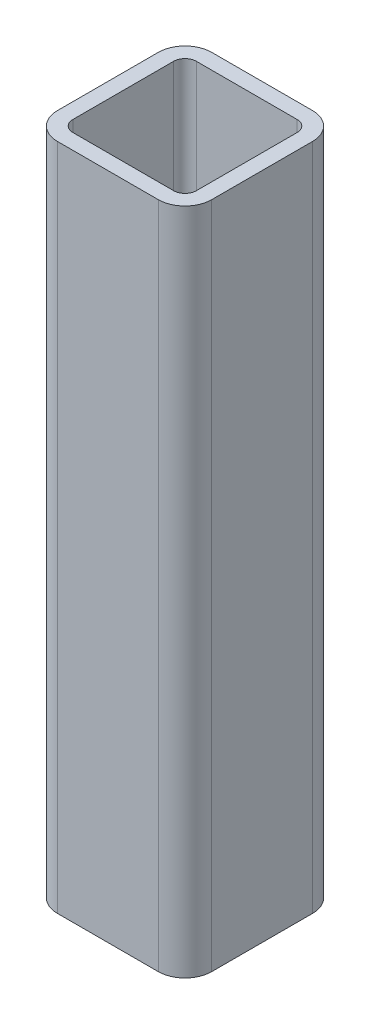
ISO-10303-21;
HEADER;
FILE_DESCRIPTION(('STEP AP214'),'2;1');
FILE_NAME('part.step','',(''),(''),'','','');
FILE_SCHEMA(('AUTOMOTIVE_DESIGN { 1 0 10303 214 1 1 1 1 }'));
ENDSEC;
DATA;
#1=APPLICATION_CONTEXT('core data for automotive mechanical design processes');
#2=APPLICATION_PROTOCOL_DEFINITION('international standard','automotive_design',2000,#1);
#3=PRODUCT_CONTEXT('',#1,'mechanical');
#4=PRODUCT('Part','Part','',(#3));
#5=PRODUCT_RELATED_PRODUCT_CATEGORY('part','',(#4));
#6=PRODUCT_DEFINITION_FORMATION('','',#4);
#7=PRODUCT_DEFINITION_CONTEXT('part definition',#1,'design');
#8=PRODUCT_DEFINITION('design','',#6,#7);
#9=PRODUCT_DEFINITION_SHAPE('','',#8);
#10=(LENGTH_UNIT() NAMED_UNIT(*) SI_UNIT(.MILLI.,.METRE.));
#11=(NAMED_UNIT(*) PLANE_ANGLE_UNIT() SI_UNIT($,.RADIAN.));
#12=(NAMED_UNIT(*) SI_UNIT($,.STERADIAN.) SOLID_ANGLE_UNIT());
#13=UNCERTAINTY_MEASURE_WITH_UNIT(LENGTH_MEASURE(1.E-05),#10,'distance_accuracy_value','');
#14=(GEOMETRIC_REPRESENTATION_CONTEXT(3) GLOBAL_UNCERTAINTY_ASSIGNED_CONTEXT((#13)) GLOBAL_UNIT_ASSIGNED_CONTEXT((#10,
#11,#12)) REPRESENTATION_CONTEXT('',''));
#15=CARTESIAN_POINT('',(0.,0.,0.));
#16=DIRECTION('',(0.,0.,1.));
#17=DIRECTION('',(1.,0.,0.));
#18=AXIS2_PLACEMENT_3D('',#15,#16,#17);
#19=CARTESIAN_POINT('',(9.8,130.,-9.8));
#20=DIRECTION('',(0.,-1.,0.));
#21=DIRECTION('',(0.,0.,-1.));
#22=AXIS2_PLACEMENT_3D('',#19,#20,#21);
#23=CYLINDRICAL_SURFACE('',#22,5.2);
#24=CARTESIAN_POINT('',(9.8,0.,-9.8));
#25=DIRECTION('',(0.,1.,0.));
#26=DIRECTION('',(0.,0.,1.));
#27=AXIS2_PLACEMENT_3D('',#24,#25,#26);
#28=CIRCLE('',#27,5.2);
#29=CARTESIAN_POINT('',(15.,0.,-9.8));
#30=VERTEX_POINT('',#29);
#31=CARTESIAN_POINT('',(9.8,0.,-15.));
#32=VERTEX_POINT('',#31);
#33=EDGE_CURVE('E239',#30,#32,#28,.T.);
#34=ORIENTED_EDGE('',*,*,#33,.T.);
#35=DIRECTION('',(0.,-1.,0.));
#36=VECTOR('',#35,1.);
#37=CARTESIAN_POINT('',(9.8,130.,-15.));
#38=LINE('',#37,#36);
#39=CARTESIAN_POINT('',(9.8,130.,-15.));
#40=VERTEX_POINT('',#39);
#41=EDGE_CURVE('E12',#40,#32,#38,.T.);
#42=ORIENTED_EDGE('',*,*,#41,.F.);
#43=CARTESIAN_POINT('',(9.8,130.,-9.8));
#44=DIRECTION('',(0.,1.,0.));
#45=DIRECTION('',(0.,0.,1.));
#46=AXIS2_PLACEMENT_3D('',#43,#44,#45);
#47=CIRCLE('',#46,5.2);
#48=CARTESIAN_POINT('',(15.,130.,-9.8));
#49=VERTEX_POINT('',#48);
#50=EDGE_CURVE('E317',#49,#40,#47,.T.);
#51=ORIENTED_EDGE('',*,*,#50,.F.);
#52=DIRECTION('',(0.,-1.,0.));
#53=VECTOR('',#52,1.);
#54=CARTESIAN_POINT('',(15.,130.,-9.8));
#55=LINE('',#54,#53);
#56=EDGE_CURVE('E254',#49,#30,#55,.T.);
#57=ORIENTED_EDGE('',*,*,#56,.T.);
#58=EDGE_LOOP('',(#34,#42,#51,#57));
#59=FACE_BOUND('',#58,.T.);
#60=ADVANCED_FACE('F67',(#59),#23,.T.);
#61=CARTESIAN_POINT('',(9.8,130.,-15.));
#62=DIRECTION('',(0.,0.,1.));
#63=DIRECTION('',(1.,0.,0.));
#64=AXIS2_PLACEMENT_3D('',#61,#62,#63);
#65=PLANE('',#64);
#66=DIRECTION('',(-1.,0.,0.));
#67=VECTOR('',#66,1.);
#68=CARTESIAN_POINT('',(9.8,0.,-15.));
#69=LINE('',#68,#67);
#70=CARTESIAN_POINT('',(-9.8,0.,-15.));
#71=VERTEX_POINT('',#70);
#72=EDGE_CURVE('E242',#32,#71,#69,.T.);
#73=ORIENTED_EDGE('',*,*,#72,.T.);
#74=DIRECTION('',(0.,-1.,0.));
#75=VECTOR('',#74,1.);
#76=CARTESIAN_POINT('',(-9.8,130.,-15.));
#77=LINE('',#76,#75);
#78=CARTESIAN_POINT('',(-9.8,130.,-15.));
#79=VERTEX_POINT('',#78);
#80=EDGE_CURVE('E77',#79,#71,#77,.T.);
#81=ORIENTED_EDGE('',*,*,#80,.F.);
#82=DIRECTION('',(-1.,0.,0.));
#83=VECTOR('',#82,1.);
#84=CARTESIAN_POINT('',(9.8,130.,-15.));
#85=LINE('',#84,#83);
#86=EDGE_CURVE('E319',#40,#79,#85,.T.);
#87=ORIENTED_EDGE('',*,*,#86,.F.);
#88=ORIENTED_EDGE('',*,*,#41,.T.);
#89=EDGE_LOOP('',(#73,#81,#87,#88));
#90=FACE_BOUND('',#89,.T.);
#91=ADVANCED_FACE('F354',(#90),#65,.F.);
#92=CARTESIAN_POINT('',(-9.8,130.,-9.8));
#93=DIRECTION('',(0.,-1.,0.));
#94=DIRECTION('',(0.,0.,-1.));
#95=AXIS2_PLACEMENT_3D('',#92,#93,#94);
#96=CYLINDRICAL_SURFACE('',#95,5.2);
#97=CARTESIAN_POINT('',(-9.8,0.,-9.8));
#98=DIRECTION('',(0.,1.,0.));
#99=DIRECTION('',(0.,0.,1.));
#100=AXIS2_PLACEMENT_3D('',#97,#98,#99);
#101=CIRCLE('',#100,5.2);
#102=CARTESIAN_POINT('',(-15.,0.,-9.8));
#103=VERTEX_POINT('',#102);
#104=EDGE_CURVE('E244',#71,#103,#101,.T.);
#105=ORIENTED_EDGE('',*,*,#104,.T.);
#106=DIRECTION('',(0.,-1.,0.));
#107=VECTOR('',#106,1.);
#108=CARTESIAN_POINT('',(-15.,130.,-9.8));
#109=LINE('',#108,#107);
#110=CARTESIAN_POINT('',(-15.,130.,-9.8));
#111=VERTEX_POINT('',#110);
#112=EDGE_CURVE('E261',#111,#103,#109,.T.);
#113=ORIENTED_EDGE('',*,*,#112,.F.);
#114=CARTESIAN_POINT('',(-9.8,130.,-9.8));
#115=DIRECTION('',(0.,1.,0.));
#116=DIRECTION('',(0.,0.,1.));
#117=AXIS2_PLACEMENT_3D('',#114,#115,#116);
#118=CIRCLE('',#117,5.2);
#119=EDGE_CURVE('E321',#79,#111,#118,.T.);
#120=ORIENTED_EDGE('',*,*,#119,.F.);
#121=ORIENTED_EDGE('',*,*,#80,.T.);
#122=EDGE_LOOP('',(#105,#113,#120,#121));
#123=FACE_BOUND('',#122,.T.);
#124=ADVANCED_FACE('F359',(#123),#96,.T.);
#125=CARTESIAN_POINT('',(-15.,130.,9.8));
#126=DIRECTION('',(1.,0.,0.));
#127=DIRECTION('',(0.,0.,-1.));
#128=AXIS2_PLACEMENT_3D('',#125,#126,#127);
#129=PLANE('',#128);
#130=DIRECTION('',(0.,0.,1.));
#131=VECTOR('',#130,1.);
#132=CARTESIAN_POINT('',(-15.,0.,9.8));
#133=LINE('',#132,#131);
#134=CARTESIAN_POINT('',(-15.,0.,9.8));
#135=VERTEX_POINT('',#134);
#136=EDGE_CURVE('E246',#103,#135,#133,.T.);
#137=ORIENTED_EDGE('',*,*,#136,.T.);
#138=DIRECTION('',(0.,-1.,0.));
#139=VECTOR('',#138,1.);
#140=CARTESIAN_POINT('',(-15.,130.,9.8));
#141=LINE('',#140,#139);
#142=CARTESIAN_POINT('',(-15.,130.,9.8));
#143=VERTEX_POINT('',#142);
#144=EDGE_CURVE('E258',#143,#135,#141,.T.);
#145=ORIENTED_EDGE('',*,*,#144,.F.);
#146=DIRECTION('',(0.,0.,1.));
#147=VECTOR('',#146,1.);
#148=CARTESIAN_POINT('',(-15.,130.,9.8));
#149=LINE('',#148,#147);
#150=EDGE_CURVE('E323',#111,#143,#149,.T.);
#151=ORIENTED_EDGE('',*,*,#150,.F.);
#152=ORIENTED_EDGE('',*,*,#112,.T.);
#153=EDGE_LOOP('',(#137,#145,#151,#152));
#154=FACE_BOUND('',#153,.T.);
#155=ADVANCED_FACE('F329',(#154),#129,.F.);
#156=CARTESIAN_POINT('',(-9.8,130.,9.8));
#157=DIRECTION('',(0.,-1.,0.));
#158=DIRECTION('',(0.,0.,-1.));
#159=AXIS2_PLACEMENT_3D('',#156,#157,#158);
#160=CYLINDRICAL_SURFACE('',#159,5.2);
#161=CARTESIAN_POINT('',(-9.8,0.,9.8));
#162=DIRECTION('',(0.,1.,0.));
#163=DIRECTION('',(0.,0.,1.));
#164=AXIS2_PLACEMENT_3D('',#161,#162,#163);
#165=CIRCLE('',#164,5.2);
#166=CARTESIAN_POINT('',(-9.8,0.,15.));
#167=VERTEX_POINT('',#166);
#168=EDGE_CURVE('E248',#135,#167,#165,.T.);
#169=ORIENTED_EDGE('',*,*,#168,.T.);
#170=DIRECTION('',(0.,-1.,0.));
#171=VECTOR('',#170,1.);
#172=CARTESIAN_POINT('',(-9.8,130.,15.));
#173=LINE('',#172,#171);
#174=CARTESIAN_POINT('',(-9.8,130.,15.));
#175=VERTEX_POINT('',#174);
#176=EDGE_CURVE('E206',#175,#167,#173,.T.);
#177=ORIENTED_EDGE('',*,*,#176,.F.);
#178=CARTESIAN_POINT('',(-9.8,130.,9.8));
#179=DIRECTION('',(0.,1.,0.));
#180=DIRECTION('',(0.,0.,1.));
#181=AXIS2_PLACEMENT_3D('',#178,#179,#180);
#182=CIRCLE('',#181,5.2);
#183=EDGE_CURVE('E197',#143,#175,#182,.T.);
#184=ORIENTED_EDGE('',*,*,#183,.F.);
#185=ORIENTED_EDGE('',*,*,#144,.T.);
#186=EDGE_LOOP('',(#169,#177,#184,#185));
#187=FACE_BOUND('',#186,.T.);
#188=ADVANCED_FACE('F333',(#187),#160,.T.);
#189=CARTESIAN_POINT('',(-9.8,130.,15.));
#190=DIRECTION('',(0.,0.,-1.));
#191=DIRECTION('',(-1.,0.,0.));
#192=AXIS2_PLACEMENT_3D('',#189,#190,#191);
#193=PLANE('',#192);
#194=DIRECTION('',(1.,0.,0.));
#195=VECTOR('',#194,1.);
#196=CARTESIAN_POINT('',(-9.8,0.,15.));
#197=LINE('',#196,#195);
#198=CARTESIAN_POINT('',(9.8,0.,15.));
#199=VERTEX_POINT('',#198);
#200=EDGE_CURVE('E205',#167,#199,#197,.T.);
#201=ORIENTED_EDGE('',*,*,#200,.T.);
#202=DIRECTION('',(0.,-1.,0.));
#203=VECTOR('',#202,1.);
#204=CARTESIAN_POINT('',(9.8,130.,15.));
#205=LINE('',#204,#203);
#206=CARTESIAN_POINT('',(9.8,130.,15.));
#207=VERTEX_POINT('',#206);
#208=EDGE_CURVE('E202',#207,#199,#205,.T.);
#209=ORIENTED_EDGE('',*,*,#208,.F.);
#210=DIRECTION('',(1.,0.,0.));
#211=VECTOR('',#210,1.);
#212=CARTESIAN_POINT('',(-9.8,130.,15.));
#213=LINE('',#212,#211);
#214=EDGE_CURVE('E191',#175,#207,#213,.T.);
#215=ORIENTED_EDGE('',*,*,#214,.F.);
#216=ORIENTED_EDGE('',*,*,#176,.T.);
#217=EDGE_LOOP('',(#201,#209,#215,#216));
#218=FACE_BOUND('',#217,.T.);
#219=ADVANCED_FACE('F203',(#218),#193,.F.);
#220=CARTESIAN_POINT('',(9.8,130.,9.8));
#221=DIRECTION('',(0.,-1.,0.));
#222=DIRECTION('',(0.,0.,-1.));
#223=AXIS2_PLACEMENT_3D('',#220,#221,#222);
#224=CYLINDRICAL_SURFACE('',#223,5.2);
#225=CARTESIAN_POINT('',(9.8,0.,9.8));
#226=DIRECTION('',(0.,1.,0.));
#227=DIRECTION('',(0.,0.,1.));
#228=AXIS2_PLACEMENT_3D('',#225,#226,#227);
#229=CIRCLE('',#228,5.2);
#230=CARTESIAN_POINT('',(15.,0.,9.8));
#231=VERTEX_POINT('',#230);
#232=EDGE_CURVE('E139',#199,#231,#229,.T.);
#233=ORIENTED_EDGE('',*,*,#232,.T.);
#234=DIRECTION('',(0.,-1.,0.));
#235=VECTOR('',#234,1.);
#236=CARTESIAN_POINT('',(15.,130.,9.8));
#237=LINE('',#236,#235);
#238=CARTESIAN_POINT('',(15.,130.,9.8));
#239=VERTEX_POINT('',#238);
#240=EDGE_CURVE('E207',#239,#231,#237,.T.);
#241=ORIENTED_EDGE('',*,*,#240,.F.);
#242=CARTESIAN_POINT('',(9.8,130.,9.8));
#243=DIRECTION('',(0.,1.,0.));
#244=DIRECTION('',(0.,0.,1.));
#245=AXIS2_PLACEMENT_3D('',#242,#243,#244);
#246=CIRCLE('',#245,5.2);
#247=EDGE_CURVE('E195',#207,#239,#246,.T.);
#248=ORIENTED_EDGE('',*,*,#247,.F.);
#249=ORIENTED_EDGE('',*,*,#208,.T.);
#250=EDGE_LOOP('',(#233,#241,#248,#249));
#251=FACE_BOUND('',#250,.T.);
#252=ADVANCED_FACE('F209',(#251),#224,.T.);
#253=CARTESIAN_POINT('',(-9.8,130.,-9.8));
#254=DIRECTION('',(0.,-1.,0.));
#255=DIRECTION('',(0.,0.,-1.));
#256=AXIS2_PLACEMENT_3D('',#253,#254,#255);
#257=CYLINDRICAL_SURFACE('',#256,2.2);
#258=CARTESIAN_POINT('',(-9.8,0.,-9.8));
#259=DIRECTION('',(0.,1.,0.));
#260=DIRECTION('',(0.,0.,1.));
#261=AXIS2_PLACEMENT_3D('',#258,#259,#260);
#262=CIRCLE('',#261,2.2);
#263=CARTESIAN_POINT('',(-9.8,0.,-12.));
#264=VERTEX_POINT('',#263);
#265=CARTESIAN_POINT('',(-12.,0.,-9.8));
#266=VERTEX_POINT('',#265);
#267=EDGE_CURVE('E215',#264,#266,#262,.T.);
#268=ORIENTED_EDGE('',*,*,#267,.F.);
#269=DIRECTION('',(0.,-1.,0.));
#270=VECTOR('',#269,1.);
#271=CARTESIAN_POINT('',(-9.8,130.,-12.));
#272=LINE('',#271,#270);
#273=CARTESIAN_POINT('',(-9.8,130.,-12.));
#274=VERTEX_POINT('',#273);
#275=EDGE_CURVE('E71',#274,#264,#272,.T.);
#276=ORIENTED_EDGE('',*,*,#275,.F.);
#277=CARTESIAN_POINT('',(-9.8,130.,-9.8));
#278=DIRECTION('',(0.,1.,0.));
#279=DIRECTION('',(0.,0.,1.));
#280=AXIS2_PLACEMENT_3D('',#277,#278,#279);
#281=CIRCLE('',#280,2.2);
#282=CARTESIAN_POINT('',(-12.,130.,-9.8));
#283=VERTEX_POINT('',#282);
#284=EDGE_CURVE('E253',#274,#283,#281,.T.);
#285=ORIENTED_EDGE('',*,*,#284,.T.);
#286=DIRECTION('',(0.,-1.,0.));
#287=VECTOR('',#286,1.);
#288=CARTESIAN_POINT('',(-12.,130.,-9.8));
#289=LINE('',#288,#287);
#290=EDGE_CURVE('E211',#283,#266,#289,.T.);
#291=ORIENTED_EDGE('',*,*,#290,.T.);
#292=EDGE_LOOP('',(#268,#276,#285,#291));
#293=FACE_BOUND('',#292,.T.);
#294=ADVANCED_FACE('F69',(#293),#257,.F.);
#295=CARTESIAN_POINT('',(9.8,130.,-12.));
#296=DIRECTION('',(0.,0.,1.));
#297=DIRECTION('',(1.,0.,0.));
#298=AXIS2_PLACEMENT_3D('',#295,#296,#297);
#299=PLANE('',#298);
#300=DIRECTION('',(-1.,0.,0.));
#301=VECTOR('',#300,1.);
#302=CARTESIAN_POINT('',(9.8,0.,-12.));
#303=LINE('',#302,#301);
#304=CARTESIAN_POINT('',(9.8,0.,-12.));
#305=VERTEX_POINT('',#304);
#306=EDGE_CURVE('E218',#305,#264,#303,.T.);
#307=ORIENTED_EDGE('',*,*,#306,.F.);
#308=DIRECTION('',(0.,-1.,0.));
#309=VECTOR('',#308,1.);
#310=CARTESIAN_POINT('',(9.8,130.,-12.));
#311=LINE('',#310,#309);
#312=CARTESIAN_POINT('',(9.8,130.,-12.));
#313=VERTEX_POINT('',#312);
#314=EDGE_CURVE('E276',#313,#305,#311,.T.);
#315=ORIENTED_EDGE('',*,*,#314,.F.);
#316=DIRECTION('',(-1.,0.,0.));
#317=VECTOR('',#316,1.);
#318=CARTESIAN_POINT('',(9.8,130.,-12.));
#319=LINE('',#318,#317);
#320=EDGE_CURVE('E285',#313,#274,#319,.T.);
#321=ORIENTED_EDGE('',*,*,#320,.T.);
#322=ORIENTED_EDGE('',*,*,#275,.T.);
#323=EDGE_LOOP('',(#307,#315,#321,#322));
#324=FACE_BOUND('',#323,.T.);
#325=ADVANCED_FACE('F283',(#324),#299,.T.);
#326=CARTESIAN_POINT('',(9.8,130.,-9.8));
#327=DIRECTION('',(0.,-1.,0.));
#328=DIRECTION('',(0.,0.,-1.));
#329=AXIS2_PLACEMENT_3D('',#326,#327,#328);
#330=CYLINDRICAL_SURFACE('',#329,2.2);
#331=CARTESIAN_POINT('',(9.8,0.,-9.8));
#332=DIRECTION('',(0.,1.,0.));
#333=DIRECTION('',(0.,0.,1.));
#334=AXIS2_PLACEMENT_3D('',#331,#332,#333);
#335=CIRCLE('',#334,2.2);
#336=CARTESIAN_POINT('',(12.,0.,-9.8));
#337=VERTEX_POINT('',#336);
#338=EDGE_CURVE('E221',#337,#305,#335,.T.);
#339=ORIENTED_EDGE('',*,*,#338,.F.);
#340=DIRECTION('',(0.,-1.,0.));
#341=VECTOR('',#340,1.);
#342=CARTESIAN_POINT('',(12.,130.,-9.8));
#343=LINE('',#342,#341);
#344=CARTESIAN_POINT('',(12.,130.,-9.8));
#345=VERTEX_POINT('',#344);
#346=EDGE_CURVE('E275',#345,#337,#343,.T.);
#347=ORIENTED_EDGE('',*,*,#346,.F.);
#348=CARTESIAN_POINT('',(9.8,130.,-9.8));
#349=DIRECTION('',(0.,1.,0.));
#350=DIRECTION('',(0.,0.,1.));
#351=AXIS2_PLACEMENT_3D('',#348,#349,#350);
#352=CIRCLE('',#351,2.2);
#353=EDGE_CURVE('E293',#345,#313,#352,.T.);
#354=ORIENTED_EDGE('',*,*,#353,.T.);
#355=ORIENTED_EDGE('',*,*,#314,.T.);
#356=EDGE_LOOP('',(#339,#347,#354,#355));
#357=FACE_BOUND('',#356,.T.);
#358=ADVANCED_FACE('F291',(#357),#330,.F.);
#359=CARTESIAN_POINT('',(12.,130.,-9.8));
#360=DIRECTION('',(-1.,0.,0.));
#361=DIRECTION('',(0.,0.,1.));
#362=AXIS2_PLACEMENT_3D('',#359,#360,#361);
#363=PLANE('',#362);
#364=DIRECTION('',(0.,0.,-1.));
#365=VECTOR('',#364,1.);
#366=CARTESIAN_POINT('',(12.,0.,-9.8));
#367=LINE('',#366,#365);
#368=CARTESIAN_POINT('',(12.,0.,9.8));
#369=VERTEX_POINT('',#368);
#370=EDGE_CURVE('E224',#369,#337,#367,.T.);
#371=ORIENTED_EDGE('',*,*,#370,.F.);
#372=DIRECTION('',(0.,-1.,0.));
#373=VECTOR('',#372,1.);
#374=CARTESIAN_POINT('',(12.,130.,9.8));
#375=LINE('',#374,#373);
#376=CARTESIAN_POINT('',(12.,130.,9.8));
#377=VERTEX_POINT('',#376);
#378=EDGE_CURVE('E273',#377,#369,#375,.T.);
#379=ORIENTED_EDGE('',*,*,#378,.F.);
#380=DIRECTION('',(0.,0.,-1.));
#381=VECTOR('',#380,1.);
#382=CARTESIAN_POINT('',(12.,130.,-9.8));
#383=LINE('',#382,#381);
#384=EDGE_CURVE('E299',#377,#345,#383,.T.);
#385=ORIENTED_EDGE('',*,*,#384,.T.);
#386=ORIENTED_EDGE('',*,*,#346,.T.);
#387=EDGE_LOOP('',(#371,#379,#385,#386));
#388=FACE_BOUND('',#387,.T.);
#389=ADVANCED_FACE('F302',(#388),#363,.T.);
#390=CARTESIAN_POINT('',(9.8,130.,9.8));
#391=DIRECTION('',(0.,-1.,0.));
#392=DIRECTION('',(0.,0.,-1.));
#393=AXIS2_PLACEMENT_3D('',#390,#391,#392);
#394=CYLINDRICAL_SURFACE('',#393,2.2);
#395=CARTESIAN_POINT('',(9.8,0.,9.8));
#396=DIRECTION('',(0.,1.,0.));
#397=DIRECTION('',(0.,0.,1.));
#398=AXIS2_PLACEMENT_3D('',#395,#396,#397);
#399=CIRCLE('',#398,2.2);
#400=CARTESIAN_POINT('',(9.8,0.,12.));
#401=VERTEX_POINT('',#400);
#402=EDGE_CURVE('E227',#401,#369,#399,.T.);
#403=ORIENTED_EDGE('',*,*,#402,.F.);
#404=DIRECTION('',(0.,-1.,0.));
#405=VECTOR('',#404,1.);
#406=CARTESIAN_POINT('',(9.8,130.,12.));
#407=LINE('',#406,#405);
#408=CARTESIAN_POINT('',(9.8,130.,12.));
#409=VERTEX_POINT('',#408);
#410=EDGE_CURVE('E271',#409,#401,#407,.T.);
#411=ORIENTED_EDGE('',*,*,#410,.F.);
#412=CARTESIAN_POINT('',(9.8,130.,9.8));
#413=DIRECTION('',(0.,1.,0.));
#414=DIRECTION('',(0.,0.,1.));
#415=AXIS2_PLACEMENT_3D('',#412,#413,#414);
#416=CIRCLE('',#415,2.2);
#417=EDGE_CURVE('E303',#409,#377,#416,.T.);
#418=ORIENTED_EDGE('',*,*,#417,.T.);
#419=ORIENTED_EDGE('',*,*,#378,.T.);
#420=EDGE_LOOP('',(#403,#411,#418,#419));
#421=FACE_BOUND('',#420,.T.);
#422=ADVANCED_FACE('F370',(#421),#394,.F.);
#423=CARTESIAN_POINT('',(-9.8,130.,12.));
#424=DIRECTION('',(0.,0.,-1.));
#425=DIRECTION('',(-1.,0.,0.));
#426=AXIS2_PLACEMENT_3D('',#423,#424,#425);
#427=PLANE('',#426);
#428=DIRECTION('',(1.,0.,0.));
#429=VECTOR('',#428,1.);
#430=CARTESIAN_POINT('',(-9.8,0.,12.));
#431=LINE('',#430,#429);
#432=CARTESIAN_POINT('',(-9.8,0.,12.));
#433=VERTEX_POINT('',#432);
#434=EDGE_CURVE('E230',#433,#401,#431,.T.);
#435=ORIENTED_EDGE('',*,*,#434,.F.);
#436=DIRECTION('',(0.,-1.,0.));
#437=VECTOR('',#436,1.);
#438=CARTESIAN_POINT('',(-9.8,130.,12.));
#439=LINE('',#438,#437);
#440=CARTESIAN_POINT('',(-9.8,130.,12.));
#441=VERTEX_POINT('',#440);
#442=EDGE_CURVE('E269',#441,#433,#439,.T.);
#443=ORIENTED_EDGE('',*,*,#442,.F.);
#444=DIRECTION('',(1.,0.,0.));
#445=VECTOR('',#444,1.);
#446=CARTESIAN_POINT('',(-9.8,130.,12.));
#447=LINE('',#446,#445);
#448=EDGE_CURVE('E305',#441,#409,#447,.T.);
#449=ORIENTED_EDGE('',*,*,#448,.T.);
#450=ORIENTED_EDGE('',*,*,#410,.T.);
#451=EDGE_LOOP('',(#435,#443,#449,#450));
#452=FACE_BOUND('',#451,.T.);
#453=ADVANCED_FACE('F366',(#452),#427,.T.);
#454=CARTESIAN_POINT('',(-9.8,130.,9.8));
#455=DIRECTION('',(0.,-1.,0.));
#456=DIRECTION('',(0.,0.,-1.));
#457=AXIS2_PLACEMENT_3D('',#454,#455,#456);
#458=CYLINDRICAL_SURFACE('',#457,2.2);
#459=CARTESIAN_POINT('',(-9.8,0.,9.8));
#460=DIRECTION('',(0.,1.,0.));
#461=DIRECTION('',(0.,0.,1.));
#462=AXIS2_PLACEMENT_3D('',#459,#460,#461);
#463=CIRCLE('',#462,2.2);
#464=CARTESIAN_POINT('',(-12.,0.,9.8));
#465=VERTEX_POINT('',#464);
#466=EDGE_CURVE('E233',#465,#433,#463,.T.);
#467=ORIENTED_EDGE('',*,*,#466,.F.);
#468=DIRECTION('',(0.,-1.,0.));
#469=VECTOR('',#468,1.);
#470=CARTESIAN_POINT('',(-12.,130.,9.8));
#471=LINE('',#470,#469);
#472=CARTESIAN_POINT('',(-12.,130.,9.8));
#473=VERTEX_POINT('',#472);
#474=EDGE_CURVE('E267',#473,#465,#471,.T.);
#475=ORIENTED_EDGE('',*,*,#474,.F.);
#476=CARTESIAN_POINT('',(-9.8,130.,9.8));
#477=DIRECTION('',(0.,1.,0.));
#478=DIRECTION('',(0.,0.,1.));
#479=AXIS2_PLACEMENT_3D('',#476,#477,#478);
#480=CIRCLE('',#479,2.2);
#481=EDGE_CURVE('E311',#473,#441,#480,.T.);
#482=ORIENTED_EDGE('',*,*,#481,.T.);
#483=ORIENTED_EDGE('',*,*,#442,.T.);
#484=EDGE_LOOP('',(#467,#475,#482,#483));
#485=FACE_BOUND('',#484,.T.);
#486=ADVANCED_FACE('F348',(#485),#458,.F.);
#487=CARTESIAN_POINT('',(-12.,130.,9.8));
#488=DIRECTION('',(1.,0.,0.));
#489=DIRECTION('',(0.,0.,-1.));
#490=AXIS2_PLACEMENT_3D('',#487,#488,#489);
#491=PLANE('',#490);
#492=DIRECTION('',(0.,0.,1.));
#493=VECTOR('',#492,1.);
#494=CARTESIAN_POINT('',(-12.,0.,9.8));
#495=LINE('',#494,#493);
#496=EDGE_CURVE('E236',#266,#465,#495,.T.);
#497=ORIENTED_EDGE('',*,*,#496,.F.);
#498=ORIENTED_EDGE('',*,*,#290,.F.);
#499=DIRECTION('',(0.,0.,1.));
#500=VECTOR('',#499,1.);
#501=CARTESIAN_POINT('',(-12.,130.,9.8));
#502=LINE('',#501,#500);
#503=EDGE_CURVE('E314',#283,#473,#502,.T.);
#504=ORIENTED_EDGE('',*,*,#503,.T.);
#505=ORIENTED_EDGE('',*,*,#474,.T.);
#506=EDGE_LOOP('',(#497,#498,#504,#505));
#507=FACE_BOUND('',#506,.T.);
#508=ADVANCED_FACE('F341',(#507),#491,.T.);
#509=CARTESIAN_POINT('',(15.,130.,-9.8));
#510=DIRECTION('',(-1.,0.,0.));
#511=DIRECTION('',(0.,0.,1.));
#512=AXIS2_PLACEMENT_3D('',#509,#510,#511);
#513=PLANE('',#512);
#514=DIRECTION('',(0.,0.,-1.));
#515=VECTOR('',#514,1.);
#516=CARTESIAN_POINT('',(15.,0.,-9.8));
#517=LINE('',#516,#515);
#518=EDGE_CURVE('E145',#231,#30,#517,.T.);
#519=ORIENTED_EDGE('',*,*,#518,.T.);
#520=ORIENTED_EDGE('',*,*,#56,.F.);
#521=DIRECTION('',(0.,0.,-1.));
#522=VECTOR('',#521,1.);
#523=CARTESIAN_POINT('',(15.,130.,-9.8));
#524=LINE('',#523,#522);
#525=EDGE_CURVE('E86',#239,#49,#524,.T.);
#526=ORIENTED_EDGE('',*,*,#525,.F.);
#527=ORIENTED_EDGE('',*,*,#240,.T.);
#528=EDGE_LOOP('',(#519,#520,#526,#527));
#529=FACE_BOUND('',#528,.T.);
#530=ADVANCED_FACE('F339',(#529),#513,.F.);
#531=CARTESIAN_POINT('',(9.8,130.,-9.8));
#532=DIRECTION('',(0.,1.,0.));
#533=DIRECTION('',(0.,0.,1.));
#534=AXIS2_PLACEMENT_3D('',#531,#532,#533);
#535=PLANE('',#534);
#536=ORIENTED_EDGE('',*,*,#284,.F.);
#537=ORIENTED_EDGE('',*,*,#320,.F.);
#538=ORIENTED_EDGE('',*,*,#353,.F.);
#539=ORIENTED_EDGE('',*,*,#384,.F.);
#540=ORIENTED_EDGE('',*,*,#417,.F.);
#541=ORIENTED_EDGE('',*,*,#448,.F.);
#542=ORIENTED_EDGE('',*,*,#481,.F.);
#543=ORIENTED_EDGE('',*,*,#503,.F.);
#544=EDGE_LOOP('',(#536,#537,#538,#539,#540,#541,#542,#543));
#545=FACE_BOUND('',#544,.T.);
#546=ORIENTED_EDGE('',*,*,#50,.T.);
#547=ORIENTED_EDGE('',*,*,#86,.T.);
#548=ORIENTED_EDGE('',*,*,#119,.T.);
#549=ORIENTED_EDGE('',*,*,#150,.T.);
#550=ORIENTED_EDGE('',*,*,#183,.T.);
#551=ORIENTED_EDGE('',*,*,#214,.T.);
#552=ORIENTED_EDGE('',*,*,#247,.T.);
#553=ORIENTED_EDGE('',*,*,#525,.T.);
#554=EDGE_LOOP('',(#546,#547,#548,#549,#550,#551,#552,#553));
#555=FACE_BOUND('',#554,.T.);
#556=ADVANCED_FACE('F193',(#545,#555),#535,.T.);
#557=CARTESIAN_POINT('',(9.8,0.,-9.8));
#558=DIRECTION('',(0.,1.,0.));
#559=DIRECTION('',(0.,0.,1.));
#560=AXIS2_PLACEMENT_3D('',#557,#558,#559);
#561=PLANE('',#560);
#562=ORIENTED_EDGE('',*,*,#267,.T.);
#563=ORIENTED_EDGE('',*,*,#496,.T.);
#564=ORIENTED_EDGE('',*,*,#466,.T.);
#565=ORIENTED_EDGE('',*,*,#434,.T.);
#566=ORIENTED_EDGE('',*,*,#402,.T.);
#567=ORIENTED_EDGE('',*,*,#370,.T.);
#568=ORIENTED_EDGE('',*,*,#338,.T.);
#569=ORIENTED_EDGE('',*,*,#306,.T.);
#570=EDGE_LOOP('',(#562,#563,#564,#565,#566,#567,#568,#569));
#571=FACE_BOUND('',#570,.T.);
#572=ORIENTED_EDGE('',*,*,#33,.F.);
#573=ORIENTED_EDGE('',*,*,#518,.F.);
#574=ORIENTED_EDGE('',*,*,#232,.F.);
#575=ORIENTED_EDGE('',*,*,#200,.F.);
#576=ORIENTED_EDGE('',*,*,#168,.F.);
#577=ORIENTED_EDGE('',*,*,#136,.F.);
#578=ORIENTED_EDGE('',*,*,#104,.F.);
#579=ORIENTED_EDGE('',*,*,#72,.F.);
#580=EDGE_LOOP('',(#572,#573,#574,#575,#576,#577,#578,#579));
#581=FACE_BOUND('',#580,.T.);
#582=ADVANCED_FACE('F288',(#571,#581),#561,.F.);
#583=CLOSED_SHELL('',(#60,#91,#124,#155,#188,#219,#252,#294,#325,#358,#389,#422,#453,#486,#508,
#530,#556,#582));
#584=MANIFOLD_SOLID_BREP('B2',#583);
#585=ADVANCED_BREP_SHAPE_REPRESENTATION('',(#18,#584),#14);
#586=SHAPE_DEFINITION_REPRESENTATION(#9,#585);
ENDSEC;
END-ISO-10303-21;
